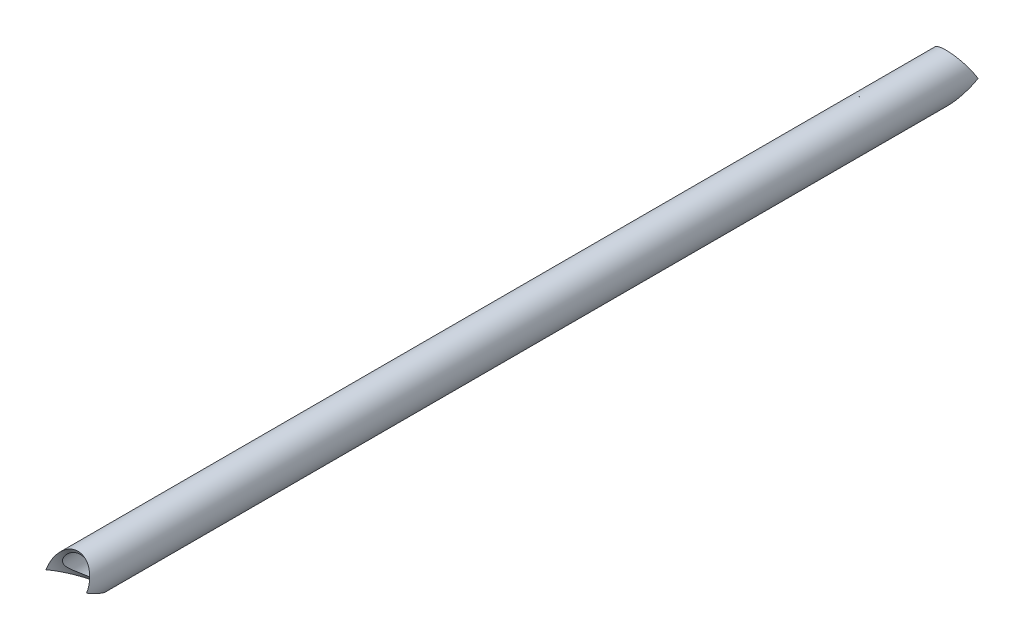
ISO-10303-21;
HEADER;
FILE_DESCRIPTION(('STEP AP214'),'2;1');
FILE_NAME('part.step','',(''),(''),'','','');
FILE_SCHEMA(('AUTOMOTIVE_DESIGN { 1 0 10303 214 1 1 1 1 }'));
ENDSEC;
DATA;
#1=APPLICATION_CONTEXT('core data for automotive mechanical design processes');
#2=APPLICATION_PROTOCOL_DEFINITION('international standard','automotive_design',2000,#1);
#3=PRODUCT_CONTEXT('',#1,'mechanical');
#4=PRODUCT('Part','Part','',(#3));
#5=PRODUCT_RELATED_PRODUCT_CATEGORY('part','',(#4));
#6=PRODUCT_DEFINITION_FORMATION('','',#4);
#7=PRODUCT_DEFINITION_CONTEXT('part definition',#1,'design');
#8=PRODUCT_DEFINITION('design','',#6,#7);
#9=PRODUCT_DEFINITION_SHAPE('','',#8);
#10=(LENGTH_UNIT() NAMED_UNIT(*) SI_UNIT(.MILLI.,.METRE.));
#11=(NAMED_UNIT(*) PLANE_ANGLE_UNIT() SI_UNIT($,.RADIAN.));
#12=(NAMED_UNIT(*) SI_UNIT($,.STERADIAN.) SOLID_ANGLE_UNIT());
#13=UNCERTAINTY_MEASURE_WITH_UNIT(LENGTH_MEASURE(1.E-05),#10,'distance_accuracy_value','');
#14=(GEOMETRIC_REPRESENTATION_CONTEXT(3) GLOBAL_UNCERTAINTY_ASSIGNED_CONTEXT((#13)) GLOBAL_UNIT_ASSIGNED_CONTEXT((#10,
#11,#12)) REPRESENTATION_CONTEXT('',''));
#15=CARTESIAN_POINT('',(0.,0.,0.));
#16=DIRECTION('',(0.,0.,1.));
#17=DIRECTION('',(1.,0.,0.));
#18=AXIS2_PLACEMENT_3D('',#15,#16,#17);
#19=CARTESIAN_POINT('',(7.22684773073331E-13,15.2249999998414,-234.657183252051));
#20=DIRECTION('',(0.,0.,1.));
#21=DIRECTION('',(1.,0.,0.));
#22=AXIS2_PLACEMENT_3D('',#19,#20,#21);
#23=CYLINDRICAL_SURFACE('',#22,10.65);
#24=CARTESIAN_POINT('',(4.00109682529952E-13,15.2249999998414,-233.790157848272));
#25=DIRECTION('',(0.,0.866025403784403,0.500000000000061));
#26=DIRECTION('',(0.,-0.500000000000061,0.866025403784403));
#27=AXIS2_PLACEMENT_3D('',#24,#25,#26);
#28=ELLIPSE('',#27,21.2999999999974,10.65);
#29=CARTESIAN_POINT('',(-10.6499999999996,15.2249999998413,-233.790157848272));
#30=VERTEX_POINT('',#29);
#31=CARTESIAN_POINT('',(10.6500000000004,15.2249999998414,-233.790157848272));
#32=VERTEX_POINT('',#31);
#33=EDGE_CURVE('E54',#30,#32,#28,.T.);
#34=ORIENTED_EDGE('',*,*,#33,.T.);
#35=CARTESIAN_POINT('',(4.00109682529952E-13,15.2249999998414,-233.790157848272));
#36=DIRECTION('',(0.,-0.500000000000061,0.866025403784403));
#37=DIRECTION('',(0.,0.866025403784403,0.500000000000061));
#38=AXIS2_PLACEMENT_3D('',#35,#36,#37);
#39=ELLIPSE('',#38,12.2975607337395,10.65);
#40=EDGE_CURVE('E49',#32,#30,#39,.T.);
#41=ORIENTED_EDGE('',*,*,#40,.T.);
#42=EDGE_LOOP('',(#34,#41));
#43=FACE_BOUND('',#42,.T.);
#44=CARTESIAN_POINT('',(4.00109682529952E-13,15.2249999998414,233.790157848272));
#45=DIRECTION('',(0.,-0.866025403784403,0.500000000000061));
#46=DIRECTION('',(0.,-0.500000000000061,-0.866025403784403));
#47=AXIS2_PLACEMENT_3D('',#44,#45,#46);
#48=ELLIPSE('',#47,21.2999999999974,10.65);
#49=CARTESIAN_POINT('',(-10.6499999999996,15.2249999998413,233.790157848272));
#50=VERTEX_POINT('',#49);
#51=CARTESIAN_POINT('',(10.6500000000004,15.2249999998414,233.790157848272));
#52=VERTEX_POINT('',#51);
#53=EDGE_CURVE('E68',#50,#52,#48,.T.);
#54=ORIENTED_EDGE('',*,*,#53,.F.);
#55=CARTESIAN_POINT('',(4.00109682529952E-13,15.2249999998414,233.790157848272));
#56=DIRECTION('',(0.,0.500000000000061,0.866025403784403));
#57=DIRECTION('',(0.,0.866025403784403,-0.500000000000061));
#58=AXIS2_PLACEMENT_3D('',#55,#56,#57);
#59=ELLIPSE('',#58,12.2975607337395,10.65);
#60=EDGE_CURVE('E64',#52,#50,#59,.T.);
#61=ORIENTED_EDGE('',*,*,#60,.F.);
#62=EDGE_LOOP('',(#54,#61));
#63=FACE_BOUND('',#62,.T.);
#64=ADVANCED_FACE('F35',(#43,#63),#23,.T.);
#65=CARTESIAN_POINT('',(7.22684773073331E-13,15.2249999998414,-234.657183252051));
#66=DIRECTION('',(0.,0.,1.));
#67=DIRECTION('',(1.,0.,0.));
#68=AXIS2_PLACEMENT_3D('',#65,#66,#67);
#69=CYLINDRICAL_SURFACE('',#68,8.65);
#70=CARTESIAN_POINT('',(8.65000000000073,15.2249999998414,-226.616130620373));
#71=CARTESIAN_POINT('',(8.64999937803399,15.3718160818004,-226.700894912656));
#72=CARTESIAN_POINT('',(8.64626274910779,15.5212442750548,-226.781146971246));
#73=CARTESIAN_POINT('',(8.63051404007079,15.8248493483921,-226.931212783866));
#74=CARTESIAN_POINT('',(8.61850310980578,15.9790255658178,-227.001027986623));
#75=CARTESIAN_POINT('',(8.58549136002982,16.2910223316641,-227.128940058791));
#76=CARTESIAN_POINT('',(8.56450206368829,16.448837964336,-227.18705180872));
#77=CARTESIAN_POINT('',(8.51297710355497,16.7669720969905,-227.290912107737));
#78=CARTESIAN_POINT('',(8.48244146927668,16.9272905892338,-227.336660695047));
#79=CARTESIAN_POINT('',(8.41148621827993,17.2489954047633,-227.415698922046));
#80=CARTESIAN_POINT('',(8.37105601253865,17.4103826906284,-227.448975116739));
#81=CARTESIAN_POINT('',(8.2803069748777,17.7323894814726,-227.503521124277));
#82=CARTESIAN_POINT('',(8.22998781020966,17.89300896043,-227.524790533017));
#83=CARTESIAN_POINT('',(8.11955918288916,18.212281770207,-227.556416745183));
#84=CARTESIAN_POINT('',(8.05943008935789,18.3709304576975,-227.566751349751));
#85=CARTESIAN_POINT('',(7.92980127102043,18.6847095954182,-227.577840909392));
#86=CARTESIAN_POINT('',(7.8602988334974,18.8398390119048,-227.578593085198));
#87=CARTESIAN_POINT('',(7.69251740767395,19.1865698489066,-227.571173814547));
#88=CARTESIAN_POINT('',(7.59151815094412,19.3768042793609,-227.560556918566));
#89=CARTESIAN_POINT('',(7.37601667855962,19.7486150847821,-227.529451608018));
#90=CARTESIAN_POINT('',(7.26151062378815,19.9301889774184,-227.508960381682));
#91=CARTESIAN_POINT('',(7.01974442801524,20.2838140012124,-227.460837924336));
#92=CARTESIAN_POINT('',(6.89247464409802,20.4558577777712,-227.433201269746));
#93=CARTESIAN_POINT('',(6.62602035216192,20.7895251718432,-227.373155903022));
#94=CARTESIAN_POINT('',(6.48683667995989,20.9511495189375,-227.340747525531));
#95=CARTESIAN_POINT('',(6.19369921715805,21.2671994087738,-227.272312791844));
#96=CARTESIAN_POINT('',(6.03946719637313,21.4213517420516,-227.236217271972));
#97=CARTESIAN_POINT('',(5.71996280968021,21.7174545818253,-227.162886020473));
#98=CARTESIAN_POINT('',(5.55469039583223,21.8594050353317,-227.125650283895));
#99=CARTESIAN_POINT('',(5.21389860048005,22.13044322919,-227.05154886657));
#100=CARTESIAN_POINT('',(5.03838164400038,22.2595339941816,-227.014683100646));
#101=CARTESIAN_POINT('',(4.67787691764229,22.5042467626478,-226.942583765292));
#102=CARTESIAN_POINT('',(4.49288897525266,22.6198685206627,-226.907350225613));
#103=CARTESIAN_POINT('',(4.08963935720841,22.8511505008844,-226.83518145493));
#104=CARTESIAN_POINT('',(3.8701826263934,22.9648531611738,-226.798622576714));
#105=CARTESIAN_POINT('',(3.4217043491622,23.173307480739,-226.730286500494));
#106=CARTESIAN_POINT('',(3.19268197861239,23.2680575030506,-226.698509715586));
#107=CARTESIAN_POINT('',(2.72667233822177,23.4377489820847,-226.640808535245));
#108=CARTESIAN_POINT('',(2.48968464132822,23.5126893748189,-226.614884454176));
#109=CARTESIAN_POINT('',(2.00954587057649,23.6420083115011,-226.569734191326));
#110=CARTESIAN_POINT('',(1.76639521489104,23.6963882465654,-226.550507556406));
#111=CARTESIAN_POINT('',(1.2868881557807,23.7820463761492,-226.520059675526));
#112=CARTESIAN_POINT('',(1.05071773862648,23.8142532416868,-226.508517392554));
#113=CARTESIAN_POINT('',(0.576287751522983,23.8590696991501,-226.492424570212));
#114=CARTESIAN_POINT('',(0.338028232849895,23.8716797707249,-226.487873859719));
#115=CARTESIAN_POINT('',(-0.13869439806505,23.8771718100365,-226.48589402504));
#116=CARTESIAN_POINT('',(-0.377157454409467,23.870058090146,-226.488463344145));
#117=CARTESIAN_POINT('',(-0.852499060907752,23.8361855579795,-226.500647238579));
#118=CARTESIAN_POINT('',(-1.08937763949892,23.8094270992359,-226.510261687123));
#119=CARTESIAN_POINT('',(-1.55084699909944,23.7379204839427,-226.535767666196));
#120=CARTESIAN_POINT('',(-1.7755636187987,23.6938912062073,-226.551407963394));
#121=CARTESIAN_POINT('',(-2.22033596035067,23.5883037351164,-226.588536726342));
#122=CARTESIAN_POINT('',(-2.44039182888852,23.5267460943044,-226.610025007746));
#123=CARTESIAN_POINT('',(-2.87439182216372,23.3866397888887,-226.658264189429));
#124=CARTESIAN_POINT('',(-3.0883367888249,23.3080934777908,-226.685014360711));
#125=CARTESIAN_POINT('',(-3.50884695014989,23.1346288265682,-226.743033986016));
#126=CARTESIAN_POINT('',(-3.71541192514846,23.0397099996052,-226.774303574419));
#127=CARTESIAN_POINT('',(-4.12561504865864,22.831325502649,-226.841372562656));
#128=CARTESIAN_POINT('',(-4.32901148650069,22.7174169406924,-226.877273860887));
#129=CARTESIAN_POINT('',(-4.72560996425138,22.4738119895755,-226.951704246459));
#130=CARTESIAN_POINT('',(-4.91881176220129,22.3441152259406,-226.990233396121));
#131=CARTESIAN_POINT('',(-5.29426000335198,22.069522023073,-227.068567357932));
#132=CARTESIAN_POINT('',(-5.47649012979042,21.9246037844437,-227.108373941341));
#133=CARTESIAN_POINT('',(-5.82873985001059,21.6205012206976,-227.187523885139));
#134=CARTESIAN_POINT('',(-5.99875927649416,21.4613167001864,-227.226867239176));
#135=CARTESIAN_POINT('',(-6.33518765876969,21.1197976712733,-227.305288821375));
#136=CARTESIAN_POINT('',(-6.50081325634361,20.9366555590635,-227.34421890609));
#137=CARTESIAN_POINT('',(-6.81634213928481,20.5561417387911,-227.416403390943));
#138=CARTESIAN_POINT('',(-6.96624167784245,20.3587666584705,-227.44965643968));
#139=CARTESIAN_POINT('',(-7.24880778216958,19.9513737623284,-227.506850657746));
#140=CARTESIAN_POINT('',(-7.38151120832192,19.7413844496542,-227.530811971641));
#141=CARTESIAN_POINT('',(-7.6287244459524,19.3099425256216,-227.565254829972));
#142=CARTESIAN_POINT('',(-7.74324661530693,19.0884978374414,-227.575745565091));
#143=CARTESIAN_POINT('',(-7.9158766152873,18.7160587990207,-227.578001893572));
#144=CARTESIAN_POINT('',(-7.97965328460072,18.5677011781322,-227.575058543148));
#145=CARTESIAN_POINT('',(-8.09865941914349,18.2680533280594,-227.560206784699));
#146=CARTESIAN_POINT('',(-8.15389168150541,18.1167640769135,-227.548301318069));
#147=CARTESIAN_POINT('',(-8.25543809691468,17.812642488713,-227.51439922725));
#148=CARTESIAN_POINT('',(-8.30176915263715,17.6598136680744,-227.492422002776));
#149=CARTESIAN_POINT('',(-8.38549388456844,17.3536556617893,-227.437533966567));
#150=CARTESIAN_POINT('',(-8.42288752849203,17.2003264743373,-227.404623115336));
#151=CARTESIAN_POINT('',(-8.48887463244747,16.8941626298631,-227.327367948635));
#152=CARTESIAN_POINT('',(-8.51744234753697,16.7413306826692,-227.282990865208));
#153=CARTESIAN_POINT('',(-8.56590540255619,16.4379970093971,-227.183005125143));
#154=CARTESIAN_POINT('',(-8.58580081854666,16.287495262893,-227.127396567016));
#155=CARTESIAN_POINT('',(-8.61742448664785,15.9898085272821,-227.005544044489));
#156=CARTESIAN_POINT('',(-8.62914387610705,15.8426273042066,-226.939288634495));
#157=CARTESIAN_POINT('',(-8.64501885033545,15.5525193055651,-226.797206811531));
#158=CARTESIAN_POINT('',(-8.64917188259929,15.4095939817121,-226.721377177925));
#159=CARTESIAN_POINT('',(-8.65091176420813,15.0680501360609,-226.526977812282));
#160=CARTESIAN_POINT('',(-8.64490991978739,14.8718927976267,-226.404044843864));
#161=CARTESIAN_POINT('',(-8.62080404537257,14.4894744259885,-226.144733870197));
#162=CARTESIAN_POINT('',(-8.6026934922007,14.3032187854212,-226.008348651759));
#163=CARTESIAN_POINT('',(-8.55591593176074,13.9394926138493,-225.724914287507));
#164=CARTESIAN_POINT('',(-8.52721453919738,13.7620528586451,-225.57783167345));
#165=CARTESIAN_POINT('',(-8.46048539057257,13.4156312779869,-225.275958862749));
#166=CARTESIAN_POINT('',(-8.42245385331461,13.2466529151682,-225.121165561541));
#167=CARTESIAN_POINT('',(-8.33930780952866,12.9215977917971,-224.811075805027));
#168=CARTESIAN_POINT('',(-8.29446233610277,12.7652804838344,-224.655957729655));
#169=CARTESIAN_POINT('',(-8.19738755509976,12.4589289374232,-224.341947907114));
#170=CARTESIAN_POINT('',(-8.14515935111355,12.3088937642409,-224.183056726907));
#171=CARTESIAN_POINT('',(-8.03358147622558,12.0142518013584,-223.862487066965));
#172=CARTESIAN_POINT('',(-7.97422521882668,11.8696501968936,-223.700806129377));
#173=CARTESIAN_POINT('',(-7.84858289044741,11.5854414017909,-223.375731108163));
#174=CARTESIAN_POINT('',(-7.78229605383265,11.4458347652481,-223.212336837058));
#175=CARTESIAN_POINT('',(-7.6427878968912,11.1711080330844,-222.884555501144));
#176=CARTESIAN_POINT('',(-7.56956237191822,11.0359907257095,-222.720167891613));
#177=CARTESIAN_POINT('',(-7.41613086611502,10.7699941087927,-222.391193952307));
#178=CARTESIAN_POINT('',(-7.33592422353052,10.6391152026343,-222.226607605156));
#179=CARTESIAN_POINT('',(-7.16842967186054,10.3814777060565,-221.898021928709));
#180=CARTESIAN_POINT('',(-7.08114669097896,10.2547163327706,-221.734022272532));
#181=CARTESIAN_POINT('',(-6.89920629382299,10.005105532055,-221.407139412466));
#182=CARTESIAN_POINT('',(-6.80454875726909,9.88225616847661,-221.244256226833));
#183=CARTESIAN_POINT('',(-6.56519981119186,9.58847523230073,-220.850624992697));
#184=CARTESIAN_POINT('',(-6.41648661666451,9.41956590659714,-220.620790515557));
#185=CARTESIAN_POINT('',(-6.10210401419089,9.08996137975766,-220.166782584085));
#186=CARTESIAN_POINT('',(-5.93643204735804,8.92926742372918,-219.942609990446));
#187=CARTESIAN_POINT('',(-5.58706670598628,8.61728432470592,-219.502991206508));
#188=CARTESIAN_POINT('',(-5.40341885193475,8.46597293363485,-219.287524830915));
#189=CARTESIAN_POINT('',(-5.01605964050921,8.17372410191782,-218.867929591923));
#190=CARTESIAN_POINT('',(-4.8123586935435,8.03278134419002,-218.663794930939));
#191=CARTESIAN_POINT('',(-4.46395431537748,7.81416399882904,-218.345039096985));
#192=CARTESIAN_POINT('',(-4.32596965085769,7.7326734644771,-218.225690934962));
#193=CARTESIAN_POINT('',(-4.04104693269429,7.57523178260297,-217.994255925192));
#194=CARTESIAN_POINT('',(-3.89410768994005,7.49928137372892,-217.882170045925));
#195=CARTESIAN_POINT('',(-3.43953622820758,7.28113656863024,-217.559209424285));
#196=CARTESIAN_POINT('',(-3.1176700065354,7.14833947075684,-217.361179221191));
#197=CARTESIAN_POINT('',(-2.51329904826346,6.94351317804898,-217.054476237116));
#198=CARTESIAN_POINT('',(-2.23837288737253,6.8645329533798,-216.93572334007));
#199=CARTESIAN_POINT('',(-1.81149183588492,6.76554405580963,-216.786571869805));
#200=CARTESIAN_POINT('',(-1.66677696284398,6.7357938880164,-216.741683181232));
#201=CARTESIAN_POINT('',(-1.37323763265758,6.6834013364604,-216.662562118053));
#202=CARTESIAN_POINT('',(-1.22441515227361,6.66075559645266,-216.628324711675));
#203=CARTESIAN_POINT('',(-0.922228530534281,6.62294244718917,-216.571124154793));
#204=CARTESIAN_POINT('',(-0.768835207762177,6.60784573111002,-216.548267588804));
#205=CARTESIAN_POINT('',(-0.460111209938584,6.58586003421763,-216.514972555521));
#206=CARTESIAN_POINT('',(-0.304780550296197,6.57897098816462,-216.504533989521));
#207=CARTESIAN_POINT('',(0.00631804623166447,6.57360376548258,-216.496401803086));
#208=CARTESIAN_POINT('',(0.162085851107275,6.57512327619661,-216.498704678295));
#209=CARTESIAN_POINT('',(0.472597570433297,6.58652292809322,-216.515975036928));
#210=CARTESIAN_POINT('',(0.627341552834819,6.59640250869252,-216.530941671187));
#211=CARTESIAN_POINT('',(0.914629127249535,6.62244206746008,-216.570362791726));
#212=CARTESIAN_POINT('',(1.04746675019312,6.63763010215889,-216.593348267607));
#213=CARTESIAN_POINT('',(1.31053948151404,6.67382250801011,-216.648078264163));
#214=CARTESIAN_POINT('',(1.44077378597097,6.69482864696322,-216.679825447027));
#215=CARTESIAN_POINT('',(1.82650942834367,6.76600299195189,-216.787286668754));
#216=CARTESIAN_POINT('',(2.0771600582016,6.82433819839789,-216.875237206605));
#217=CARTESIAN_POINT('',(2.67701044964176,6.99129326287316,-217.126182647155));
#218=CARTESIAN_POINT('',(3.01657143771883,7.11064022715641,-217.304986048958));
#219=CARTESIAN_POINT('',(3.49694388024367,7.31145299122882,-217.603895772405));
#220=CARTESIAN_POINT('',(3.65245291749751,7.38214607662005,-217.708831773185));
#221=CARTESIAN_POINT('',(3.95415605806255,7.52985212378962,-217.927311057518));
#222=CARTESIAN_POINT('',(4.10035178316934,7.60686397986046,-218.040852834902));
#223=CARTESIAN_POINT('',(4.47217067277774,7.81608637468817,-218.348079482024));
#224=CARTESIAN_POINT('',(4.69046621582142,7.95276812552853,-218.547583966102));
#225=CARTESIAN_POINT('',(5.10542040242039,8.23782777040412,-218.960323284901));
#226=CARTESIAN_POINT('',(5.30206445824768,8.38621343583037,-219.173567225109));
#227=CARTESIAN_POINT('',(5.6761968927379,8.69337975103346,-219.610725395218));
#228=CARTESIAN_POINT('',(5.8536163377949,8.85219472835012,-219.8346741262));
#229=CARTESIAN_POINT('',(6.19021131260048,9.17861787721255,-220.289589023201));
#230=CARTESIAN_POINT('',(6.34939068740982,9.34622418462009,-220.520553697203));
#231=CARTESIAN_POINT('',(6.61712450602773,9.65117219441522,-220.934822249236));
#232=CARTESIAN_POINT('',(6.72902472853608,9.78686772898764,-221.117193803593));
#233=CARTESIAN_POINT('',(6.94326792392773,10.0632070998694,-221.483827944587));
#234=CARTESIAN_POINT('',(7.04560988610146,10.2038514573172,-221.668090728924));
#235=CARTESIAN_POINT('',(7.24122557898535,10.4903127286803,-222.03774866404));
#236=CARTESIAN_POINT('',(7.33449006193109,10.6361347152108,-222.223144769267));
#237=CARTESIAN_POINT('',(7.51210861764725,10.9330709704614,-222.593950216426));
#238=CARTESIAN_POINT('',(7.59646314201729,11.0841849704392,-222.77935955721));
#239=CARTESIAN_POINT('',(7.75620337110443,11.3917551404212,-223.148743259354));
#240=CARTESIAN_POINT('',(7.83161100983228,11.548196982583,-223.33272005168));
#241=CARTESIAN_POINT('',(7.97368173187824,11.8674074246159,-223.698604343378));
#242=CARTESIAN_POINT('',(8.04034383363478,12.0301767320015,-223.880511608386));
#243=CARTESIAN_POINT('',(8.16459670931782,12.362604265179,-224.24063285936));
#244=CARTESIAN_POINT('',(8.22219981237337,12.5322527257581,-224.418851573229));
#245=CARTESIAN_POINT('',(8.32794134031553,12.8796099363814,-224.770109211847));
#246=CARTESIAN_POINT('',(8.37608284212301,13.0573160428585,-224.943149804955));
#247=CARTESIAN_POINT('',(8.4547282351654,13.3908305214131,-225.252923227304));
#248=CARTESIAN_POINT('',(8.48684042867074,13.5451878792815,-225.390805261547));
#249=CARTESIAN_POINT('',(8.54328935211265,13.8610184911046,-225.659918498234));
#250=CARTESIAN_POINT('',(8.56762596647581,14.0224918507884,-225.791149601796));
#251=CARTESIAN_POINT('',(8.607516195672,14.3527812061863,-226.044638846325));
#252=CARTESIAN_POINT('',(8.62309164938118,14.5215778045945,-226.166918631652));
#253=CARTESIAN_POINT('',(8.64433263886653,14.8672631772307,-226.40045613941));
#254=CARTESIAN_POINT('',(8.65000076614836,15.0441498228808,-226.511716736996));
#255=CARTESIAN_POINT('',(8.65000000000073,15.2249999998414,-226.616130620373));
#256=B_SPLINE_CURVE_WITH_KNOTS('',3,(#70,#71,#72,#73,#74,#75,#76,#77,#78,#79,#80,#81,#82,#83,
#84,#85,#86,#87,#88,#89,#90,#91,#92,#93,#94,#95,#96,#97,#98,#99,#100,#101,#102,#103,#104,#105,
#106,#107,#108,#109,#110,#111,#112,#113,#114,#115,#116,#117,#118,#119,#120,#121,#122,#123,#124,
#125,#126,#127,#128,#129,#130,#131,#132,#133,#134,#135,#136,#137,#138,#139,#140,#141,#142,#143,
#144,#145,#146,#147,#148,#149,#150,#151,#152,#153,#154,#155,#156,#157,#158,#159,#160,#161,#162,
#163,#164,#165,#166,#167,#168,#169,#170,#171,#172,#173,#174,#175,#176,#177,#178,#179,#180,#181,
#182,#183,#184,#185,#186,#187,#188,#189,#190,#191,#192,#193,#194,#195,#196,#197,#198,#199,#200,
#201,#202,#203,#204,#205,#206,#207,#208,#209,#210,#211,#212,#213,#214,#215,#216,#217,#218,#219,
#220,#221,#222,#223,#224,#225,#226,#227,#228,#229,#230,#231,#232,#233,#234,#235,#236,#237,#238,
#239,#240,#241,#242,#243,#244,#245,#246,#247,#248,#249,#250,#251,#252,#253,#254,#255),
.UNSPECIFIED.,.T.,.F.,(4,2,2,2,2,2,2,2,2,2,2,2,2,2,2,2,2,2,2,2,2,2,2,2,2,2,2,2,2,2,2,2,2,2,2,2,
2,2,2,2,2,2,2,2,2,2,2,2,2,2,2,2,2,2,2,2,2,2,2,2,2,2,2,2,2,2,2,2,2,2,2,2,2,2,2,2,2,2,2,2,2,2,2,2,
2,2,2,2,2,2,2,2,4),(0.,0.508445067700304,1.01681949312016,1.52454340032971,2.03226573787227,
2.5405338267372,3.04881902097625,3.55813412185301,4.06759693996513,4.7135900294723,
5.35976717786657,6.00643624012391,6.65305997254452,7.3155184468505,7.97797979789311,
8.64028496620519,9.30260220250532,10.0512091879149,10.7998808036042,11.5485926227774,
12.2972537751966,13.0122575701414,13.7272438644486,14.4420738478244,15.1568909672328,
15.8446653307735,16.5324180161263,17.2200754854146,17.9077534057855,18.6145823037829,
19.3214279700604,20.0293001149049,20.73718195642,21.4861817527537,22.2353595985672,
22.9829040159488,23.7299381285006,24.214039266468,24.697981590178,25.1809956610559,
25.6640114767328,26.1484232132304,26.6328307010897,27.117762464654,27.6028577893435,
28.2964167818696,28.9903497083938,29.6865557409422,30.38304439003,31.0569944659833,
31.7308439043491,32.4053208577867,33.0798724008737,33.7548353491974,34.4298623484519,
35.1044232089346,35.7789950738538,36.7434305731185,37.708011809881,38.6702106916391,
39.6319126633933,40.2309613246266,40.8300897097655,42.0261773485563,42.9515592316289,
43.4142860297682,43.8767938980602,44.3435554209341,44.810313233666,45.2769426775155,
45.7435408340741,46.1500870679642,46.5567569645802,47.3697458590112,48.5683011522661,
49.1693990091056,49.7703919045979,50.7462014804331,51.722664537754,52.7025204724632,
53.6821694691644,54.4420360299657,55.2019828498199,55.962695941976,56.723370459009,
57.4821398028629,58.2409942350118,58.9988067717564,59.7563724579487,60.3844095628079,
61.0124560021508,61.6389298975943,62.2652398987969),.UNSPECIFIED.);
#257=CARTESIAN_POINT('',(8.65000000000073,15.2249999998414,-226.616130620373));
#258=VERTEX_POINT('',#257);
#259=EDGE_CURVE('E11',#258,#258,#256,.T.);
#260=ORIENTED_EDGE('',*,*,#259,.F.);
#261=EDGE_LOOP('',(#260));
#262=FACE_BOUND('',#261,.T.);
#263=CARTESIAN_POINT('',(8.65000000000073,15.2249999998414,226.616130620373));
#264=CARTESIAN_POINT('',(8.64999937803399,15.3718160818004,226.700894912656));
#265=CARTESIAN_POINT('',(8.64626274910779,15.5212442750548,226.781146971246));
#266=CARTESIAN_POINT('',(8.63051404007079,15.8248493483921,226.931212783866));
#267=CARTESIAN_POINT('',(8.61850310980578,15.9790255658178,227.001027986623));
#268=CARTESIAN_POINT('',(8.58549136002982,16.2910223316641,227.128940058791));
#269=CARTESIAN_POINT('',(8.56450206368829,16.448837964336,227.18705180872));
#270=CARTESIAN_POINT('',(8.51297710355497,16.7669720969905,227.290912107737));
#271=CARTESIAN_POINT('',(8.48244146927668,16.9272905892338,227.336660695047));
#272=CARTESIAN_POINT('',(8.41148621827993,17.2489954047633,227.415698922046));
#273=CARTESIAN_POINT('',(8.37105601253865,17.4103826906284,227.448975116739));
#274=CARTESIAN_POINT('',(8.2803069748777,17.7323894814726,227.503521124277));
#275=CARTESIAN_POINT('',(8.22998781020966,17.89300896043,227.524790533017));
#276=CARTESIAN_POINT('',(8.11955918288916,18.212281770207,227.556416745183));
#277=CARTESIAN_POINT('',(8.05943008935789,18.3709304576975,227.566751349751));
#278=CARTESIAN_POINT('',(7.92980127102043,18.6847095954182,227.577840909392));
#279=CARTESIAN_POINT('',(7.8602988334974,18.8398390119048,227.578593085198));
#280=CARTESIAN_POINT('',(7.69251740767395,19.1865698489066,227.571173814547));
#281=CARTESIAN_POINT('',(7.59151815094412,19.3768042793609,227.560556918566));
#282=CARTESIAN_POINT('',(7.37601667855962,19.7486150847821,227.529451608018));
#283=CARTESIAN_POINT('',(7.26151062378815,19.9301889774184,227.508960381682));
#284=CARTESIAN_POINT('',(7.01974442801524,20.2838140012124,227.460837924336));
#285=CARTESIAN_POINT('',(6.89247464409802,20.4558577777712,227.433201269746));
#286=CARTESIAN_POINT('',(6.62602035216192,20.7895251718432,227.373155903022));
#287=CARTESIAN_POINT('',(6.48683667995989,20.9511495189375,227.340747525531));
#288=CARTESIAN_POINT('',(6.19369921715805,21.2671994087738,227.272312791844));
#289=CARTESIAN_POINT('',(6.03946719637313,21.4213517420516,227.236217271972));
#290=CARTESIAN_POINT('',(5.71996280968021,21.7174545818253,227.162886020473));
#291=CARTESIAN_POINT('',(5.55469039583223,21.8594050353317,227.125650283895));
#292=CARTESIAN_POINT('',(5.21389860048005,22.13044322919,227.05154886657));
#293=CARTESIAN_POINT('',(5.03838164400038,22.2595339941816,227.014683100646));
#294=CARTESIAN_POINT('',(4.67787691764229,22.5042467626478,226.942583765292));
#295=CARTESIAN_POINT('',(4.49288897525266,22.6198685206627,226.907350225613));
#296=CARTESIAN_POINT('',(4.08963935720841,22.8511505008844,226.83518145493));
#297=CARTESIAN_POINT('',(3.8701826263934,22.9648531611738,226.798622576714));
#298=CARTESIAN_POINT('',(3.4217043491622,23.173307480739,226.730286500494));
#299=CARTESIAN_POINT('',(3.19268197861239,23.2680575030506,226.698509715586));
#300=CARTESIAN_POINT('',(2.72667233822177,23.4377489820847,226.640808535245));
#301=CARTESIAN_POINT('',(2.48968464132822,23.5126893748189,226.614884454176));
#302=CARTESIAN_POINT('',(2.00954587057649,23.6420083115011,226.569734191326));
#303=CARTESIAN_POINT('',(1.76639521489104,23.6963882465654,226.550507556406));
#304=CARTESIAN_POINT('',(1.2868881557807,23.7820463761492,226.520059675526));
#305=CARTESIAN_POINT('',(1.05071773862648,23.8142532416868,226.508517392554));
#306=CARTESIAN_POINT('',(0.576287751522983,23.8590696991501,226.492424570212));
#307=CARTESIAN_POINT('',(0.338028232849895,23.8716797707249,226.487873859719));
#308=CARTESIAN_POINT('',(-0.13869439806505,23.8771718100365,226.48589402504));
#309=CARTESIAN_POINT('',(-0.377157454409467,23.870058090146,226.488463344145));
#310=CARTESIAN_POINT('',(-0.852499060907752,23.8361855579795,226.500647238579));
#311=CARTESIAN_POINT('',(-1.08937763949892,23.8094270992359,226.510261687123));
#312=CARTESIAN_POINT('',(-1.55084699909944,23.7379204839427,226.535767666196));
#313=CARTESIAN_POINT('',(-1.7755636187987,23.6938912062073,226.551407963394));
#314=CARTESIAN_POINT('',(-2.22033596035067,23.5883037351164,226.588536726342));
#315=CARTESIAN_POINT('',(-2.44039182888852,23.5267460943044,226.610025007746));
#316=CARTESIAN_POINT('',(-2.87439182216372,23.3866397888887,226.658264189429));
#317=CARTESIAN_POINT('',(-3.0883367888249,23.3080934777908,226.685014360711));
#318=CARTESIAN_POINT('',(-3.50884695014989,23.1346288265682,226.743033986016));
#319=CARTESIAN_POINT('',(-3.71541192514846,23.0397099996052,226.774303574419));
#320=CARTESIAN_POINT('',(-4.12561504865864,22.831325502649,226.841372562656));
#321=CARTESIAN_POINT('',(-4.32901148650069,22.7174169406924,226.877273860887));
#322=CARTESIAN_POINT('',(-4.72560996425138,22.4738119895755,226.951704246459));
#323=CARTESIAN_POINT('',(-4.91881176220129,22.3441152259406,226.990233396121));
#324=CARTESIAN_POINT('',(-5.29426000335198,22.069522023073,227.068567357932));
#325=CARTESIAN_POINT('',(-5.47649012979042,21.9246037844437,227.108373941341));
#326=CARTESIAN_POINT('',(-5.82873985001059,21.6205012206976,227.187523885139));
#327=CARTESIAN_POINT('',(-5.99875927649416,21.4613167001864,227.226867239176));
#328=CARTESIAN_POINT('',(-6.33518765876969,21.1197976712733,227.305288821375));
#329=CARTESIAN_POINT('',(-6.50081325634361,20.9366555590635,227.34421890609));
#330=CARTESIAN_POINT('',(-6.81634213928481,20.5561417387911,227.416403390943));
#331=CARTESIAN_POINT('',(-6.96624167784245,20.3587666584705,227.44965643968));
#332=CARTESIAN_POINT('',(-7.24880778216958,19.9513737623284,227.506850657746));
#333=CARTESIAN_POINT('',(-7.38151120832192,19.7413844496542,227.530811971641));
#334=CARTESIAN_POINT('',(-7.6287244459524,19.3099425256216,227.565254829972));
#335=CARTESIAN_POINT('',(-7.74324661530693,19.0884978374414,227.575745565091));
#336=CARTESIAN_POINT('',(-7.9158766152873,18.7160587990207,227.578001893572));
#337=CARTESIAN_POINT('',(-7.97965328460072,18.5677011781322,227.575058543148));
#338=CARTESIAN_POINT('',(-8.09865941914349,18.2680533280594,227.560206784699));
#339=CARTESIAN_POINT('',(-8.15389168150541,18.1167640769135,227.548301318069));
#340=CARTESIAN_POINT('',(-8.25543809691468,17.812642488713,227.51439922725));
#341=CARTESIAN_POINT('',(-8.30176915263715,17.6598136680744,227.492422002776));
#342=CARTESIAN_POINT('',(-8.38549388456844,17.3536556617893,227.437533966567));
#343=CARTESIAN_POINT('',(-8.42288752849203,17.2003264743373,227.404623115336));
#344=CARTESIAN_POINT('',(-8.48887463244747,16.8941626298631,227.327367948635));
#345=CARTESIAN_POINT('',(-8.51744234753697,16.7413306826692,227.282990865208));
#346=CARTESIAN_POINT('',(-8.56590540255619,16.4379970093971,227.183005125143));
#347=CARTESIAN_POINT('',(-8.58580081854666,16.287495262893,227.127396567016));
#348=CARTESIAN_POINT('',(-8.61742448664785,15.9898085272821,227.005544044489));
#349=CARTESIAN_POINT('',(-8.62914387610705,15.8426273042066,226.939288634495));
#350=CARTESIAN_POINT('',(-8.64501885033545,15.5525193055651,226.797206811531));
#351=CARTESIAN_POINT('',(-8.64917188259929,15.4095939817121,226.721377177925));
#352=CARTESIAN_POINT('',(-8.65091176420813,15.0680501360609,226.526977812282));
#353=CARTESIAN_POINT('',(-8.64490991978739,14.8718927976267,226.404044843864));
#354=CARTESIAN_POINT('',(-8.62080404537257,14.4894744259885,226.144733870197));
#355=CARTESIAN_POINT('',(-8.6026934922007,14.3032187854212,226.008348651759));
#356=CARTESIAN_POINT('',(-8.55591593176074,13.9394926138493,225.724914287507));
#357=CARTESIAN_POINT('',(-8.52721453919738,13.7620528586451,225.57783167345));
#358=CARTESIAN_POINT('',(-8.46048539057257,13.4156312779869,225.275958862749));
#359=CARTESIAN_POINT('',(-8.42245385331461,13.2466529151682,225.121165561541));
#360=CARTESIAN_POINT('',(-8.33930780952866,12.9215977917971,224.811075805027));
#361=CARTESIAN_POINT('',(-8.29446233610277,12.7652804838344,224.655957729655));
#362=CARTESIAN_POINT('',(-8.19738755509976,12.4589289374232,224.341947907114));
#363=CARTESIAN_POINT('',(-8.14515935111355,12.3088937642409,224.183056726907));
#364=CARTESIAN_POINT('',(-8.03358147622558,12.0142518013584,223.862487066965));
#365=CARTESIAN_POINT('',(-7.97422521882668,11.8696501968936,223.700806129377));
#366=CARTESIAN_POINT('',(-7.84858289044741,11.5854414017909,223.375731108163));
#367=CARTESIAN_POINT('',(-7.78229605383265,11.4458347652481,223.212336837058));
#368=CARTESIAN_POINT('',(-7.6427878968912,11.1711080330844,222.884555501144));
#369=CARTESIAN_POINT('',(-7.56956237191822,11.0359907257095,222.720167891613));
#370=CARTESIAN_POINT('',(-7.41613086611502,10.7699941087927,222.391193952307));
#371=CARTESIAN_POINT('',(-7.33592422353052,10.6391152026343,222.226607605156));
#372=CARTESIAN_POINT('',(-7.16842967186054,10.3814777060565,221.898021928709));
#373=CARTESIAN_POINT('',(-7.08114669097896,10.2547163327706,221.734022272532));
#374=CARTESIAN_POINT('',(-6.89920629382299,10.005105532055,221.407139412466));
#375=CARTESIAN_POINT('',(-6.80454875726909,9.88225616847661,221.244256226833));
#376=CARTESIAN_POINT('',(-6.56519981119186,9.58847523230073,220.850624992697));
#377=CARTESIAN_POINT('',(-6.41648661666451,9.41956590659714,220.620790515557));
#378=CARTESIAN_POINT('',(-6.10210401419089,9.08996137975766,220.166782584085));
#379=CARTESIAN_POINT('',(-5.93643204735804,8.92926742372918,219.942609990446));
#380=CARTESIAN_POINT('',(-5.58706670598628,8.61728432470592,219.502991206508));
#381=CARTESIAN_POINT('',(-5.40341885193475,8.46597293363485,219.287524830915));
#382=CARTESIAN_POINT('',(-5.01605964050921,8.17372410191782,218.867929591923));
#383=CARTESIAN_POINT('',(-4.8123586935435,8.03278134419002,218.663794930939));
#384=CARTESIAN_POINT('',(-4.46395431537748,7.81416399882904,218.345039096985));
#385=CARTESIAN_POINT('',(-4.32596965085769,7.7326734644771,218.225690934962));
#386=CARTESIAN_POINT('',(-4.04104693269429,7.57523178260297,217.994255925192));
#387=CARTESIAN_POINT('',(-3.89410768994005,7.49928137372892,217.882170045925));
#388=CARTESIAN_POINT('',(-3.43953622820758,7.28113656863024,217.559209424285));
#389=CARTESIAN_POINT('',(-3.1176700065354,7.14833947075684,217.361179221191));
#390=CARTESIAN_POINT('',(-2.51329904826346,6.94351317804898,217.054476237116));
#391=CARTESIAN_POINT('',(-2.23837288737253,6.8645329533798,216.93572334007));
#392=CARTESIAN_POINT('',(-1.81149183588492,6.76554405580963,216.786571869805));
#393=CARTESIAN_POINT('',(-1.66677696284398,6.7357938880164,216.741683181232));
#394=CARTESIAN_POINT('',(-1.37323763265758,6.6834013364604,216.662562118053));
#395=CARTESIAN_POINT('',(-1.22441515227361,6.66075559645266,216.628324711675));
#396=CARTESIAN_POINT('',(-0.922228530534281,6.62294244718917,216.571124154793));
#397=CARTESIAN_POINT('',(-0.768835207762177,6.60784573111002,216.548267588804));
#398=CARTESIAN_POINT('',(-0.460111209938584,6.58586003421763,216.514972555521));
#399=CARTESIAN_POINT('',(-0.304780550296197,6.57897098816462,216.504533989521));
#400=CARTESIAN_POINT('',(0.00631804623166447,6.57360376548258,216.496401803086));
#401=CARTESIAN_POINT('',(0.162085851107275,6.57512327619661,216.498704678295));
#402=CARTESIAN_POINT('',(0.472597570433297,6.58652292809322,216.515975036928));
#403=CARTESIAN_POINT('',(0.627341552834819,6.59640250869252,216.530941671187));
#404=CARTESIAN_POINT('',(0.914629127249535,6.62244206746008,216.570362791726));
#405=CARTESIAN_POINT('',(1.04746675019312,6.63763010215889,216.593348267607));
#406=CARTESIAN_POINT('',(1.31053948151404,6.67382250801011,216.648078264163));
#407=CARTESIAN_POINT('',(1.44077378597097,6.69482864696322,216.679825447027));
#408=CARTESIAN_POINT('',(1.82650942834367,6.76600299195189,216.787286668754));
#409=CARTESIAN_POINT('',(2.0771600582016,6.82433819839789,216.875237206605));
#410=CARTESIAN_POINT('',(2.67701044964176,6.99129326287316,217.126182647155));
#411=CARTESIAN_POINT('',(3.01657143771883,7.11064022715641,217.304986048958));
#412=CARTESIAN_POINT('',(3.49694388024367,7.31145299122882,217.603895772405));
#413=CARTESIAN_POINT('',(3.65245291749751,7.38214607662005,217.708831773185));
#414=CARTESIAN_POINT('',(3.95415605806255,7.52985212378962,217.927311057518));
#415=CARTESIAN_POINT('',(4.10035178316934,7.60686397986046,218.040852834902));
#416=CARTESIAN_POINT('',(4.47217067277774,7.81608637468817,218.348079482024));
#417=CARTESIAN_POINT('',(4.69046621582142,7.95276812552853,218.547583966102));
#418=CARTESIAN_POINT('',(5.10542040242039,8.23782777040412,218.960323284901));
#419=CARTESIAN_POINT('',(5.30206445824768,8.38621343583037,219.173567225109));
#420=CARTESIAN_POINT('',(5.6761968927379,8.69337975103346,219.610725395218));
#421=CARTESIAN_POINT('',(5.8536163377949,8.85219472835012,219.8346741262));
#422=CARTESIAN_POINT('',(6.19021131260048,9.17861787721255,220.289589023201));
#423=CARTESIAN_POINT('',(6.34939068740982,9.34622418462009,220.520553697203));
#424=CARTESIAN_POINT('',(6.61712450602773,9.65117219441522,220.934822249236));
#425=CARTESIAN_POINT('',(6.72902472853608,9.78686772898764,221.117193803593));
#426=CARTESIAN_POINT('',(6.94326792392773,10.0632070998694,221.483827944587));
#427=CARTESIAN_POINT('',(7.04560988610146,10.2038514573172,221.668090728924));
#428=CARTESIAN_POINT('',(7.24122557898535,10.4903127286803,222.03774866404));
#429=CARTESIAN_POINT('',(7.33449006193109,10.6361347152108,222.223144769267));
#430=CARTESIAN_POINT('',(7.51210861764725,10.9330709704614,222.593950216426));
#431=CARTESIAN_POINT('',(7.59646314201729,11.0841849704392,222.77935955721));
#432=CARTESIAN_POINT('',(7.75620337110443,11.3917551404212,223.148743259354));
#433=CARTESIAN_POINT('',(7.83161100983228,11.548196982583,223.33272005168));
#434=CARTESIAN_POINT('',(7.97368173187824,11.8674074246159,223.698604343378));
#435=CARTESIAN_POINT('',(8.04034383363478,12.0301767320015,223.880511608386));
#436=CARTESIAN_POINT('',(8.16459670931782,12.362604265179,224.24063285936));
#437=CARTESIAN_POINT('',(8.22219981237337,12.5322527257581,224.418851573229));
#438=CARTESIAN_POINT('',(8.32794134031553,12.8796099363814,224.770109211847));
#439=CARTESIAN_POINT('',(8.37608284212301,13.0573160428585,224.943149804955));
#440=CARTESIAN_POINT('',(8.4547282351654,13.3908305214131,225.252923227304));
#441=CARTESIAN_POINT('',(8.48684042867074,13.5451878792815,225.390805261547));
#442=CARTESIAN_POINT('',(8.54328935211265,13.8610184911046,225.659918498234));
#443=CARTESIAN_POINT('',(8.56762596647581,14.0224918507884,225.791149601796));
#444=CARTESIAN_POINT('',(8.607516195672,14.3527812061863,226.044638846325));
#445=CARTESIAN_POINT('',(8.62309164938118,14.5215778045945,226.166918631652));
#446=CARTESIAN_POINT('',(8.64433263886653,14.8672631772307,226.40045613941));
#447=CARTESIAN_POINT('',(8.65000076614836,15.0441498228808,226.511716736996));
#448=CARTESIAN_POINT('',(8.65000000000073,15.2249999998414,226.616130620373));
#449=B_SPLINE_CURVE_WITH_KNOTS('',3,(#263,#264,#265,#266,#267,#268,#269,#270,#271,#272,#273,
#274,#275,#276,#277,#278,#279,#280,#281,#282,#283,#284,#285,#286,#287,#288,#289,#290,#291,#292,
#293,#294,#295,#296,#297,#298,#299,#300,#301,#302,#303,#304,#305,#306,#307,#308,#309,#310,#311,
#312,#313,#314,#315,#316,#317,#318,#319,#320,#321,#322,#323,#324,#325,#326,#327,#328,#329,#330,
#331,#332,#333,#334,#335,#336,#337,#338,#339,#340,#341,#342,#343,#344,#345,#346,#347,#348,#349,
#350,#351,#352,#353,#354,#355,#356,#357,#358,#359,#360,#361,#362,#363,#364,#365,#366,#367,#368,
#369,#370,#371,#372,#373,#374,#375,#376,#377,#378,#379,#380,#381,#382,#383,#384,#385,#386,#387,
#388,#389,#390,#391,#392,#393,#394,#395,#396,#397,#398,#399,#400,#401,#402,#403,#404,#405,#406,
#407,#408,#409,#410,#411,#412,#413,#414,#415,#416,#417,#418,#419,#420,#421,#422,#423,#424,#425,
#426,#427,#428,#429,#430,#431,#432,#433,#434,#435,#436,#437,#438,#439,#440,#441,#442,#443,#444,
#445,#446,#447,#448),.UNSPECIFIED.,.T.,.F.,(4,2,2,2,2,2,2,2,2,2,2,2,2,2,2,2,2,2,2,2,2,2,2,2,2,2,
2,2,2,2,2,2,2,2,2,2,2,2,2,2,2,2,2,2,2,2,2,2,2,2,2,2,2,2,2,2,2,2,2,2,2,2,2,2,2,2,2,2,2,2,2,2,2,2,
2,2,2,2,2,2,2,2,2,2,2,2,2,2,2,2,2,2,4),(0.,0.508445067700304,1.01681949312016,1.52454340032971,
2.03226573787227,2.5405338267372,3.04881902097625,3.55813412185301,4.06759693996513,
4.7135900294723,5.35976717786657,6.00643624012391,6.65305997254452,7.3155184468505,
7.97797979789311,8.64028496620519,9.30260220250532,10.0512091879149,10.7998808036042,
11.5485926227774,12.2972537751966,13.0122575701414,13.7272438644486,14.4420738478244,
15.1568909672328,15.8446653307735,16.5324180161263,17.2200754854146,17.9077534057855,
18.6145823037829,19.3214279700604,20.0293001149049,20.73718195642,21.4861817527537,
22.2353595985672,22.9829040159488,23.7299381285006,24.214039266468,24.697981590178,
25.1809956610559,25.6640114767328,26.1484232132304,26.6328307010897,27.117762464654,
27.6028577893435,28.2964167818696,28.9903497083938,29.6865557409422,30.38304439003,
31.0569944659833,31.7308439043491,32.4053208577867,33.0798724008737,33.7548353491974,
34.4298623484519,35.1044232089346,35.7789950738538,36.7434305731185,37.708011809881,
38.6702106916391,39.6319126633933,40.2309613246266,40.8300897097655,42.0261773485563,
42.9515592316289,43.4142860297682,43.8767938980602,44.3435554209341,44.810313233666,
45.2769426775155,45.7435408340741,46.1500870679642,46.5567569645802,47.3697458590112,
48.5683011522661,49.1693990091056,49.7703919045979,50.7462014804331,51.722664537754,
52.7025204724632,53.6821694691644,54.4420360299657,55.2019828498199,55.962695941976,
56.723370459009,57.4821398028629,58.2409942350118,58.9988067717564,59.7563724579487,
60.3844095628079,61.0124560021508,61.6389298975943,62.2652398987969),.UNSPECIFIED.);
#450=CARTESIAN_POINT('',(8.65000000000073,15.2249999998414,226.616130620373));
#451=VERTEX_POINT('',#450);
#452=EDGE_CURVE('E70',#451,#451,#449,.T.);
#453=ORIENTED_EDGE('',*,*,#452,.T.);
#454=EDGE_LOOP('',(#453));
#455=FACE_BOUND('',#454,.T.);
#456=ADVANCED_FACE('F84',(#262,#455),#69,.F.);
#457=CARTESIAN_POINT('',(1.07704132147375E-13,0.749999999825224,-225.433012701746));
#458=DIRECTION('',(0.,-0.866025403784509,0.499999999999877));
#459=DIRECTION('',(-1.27906787077986E-10,-0.499999999999877,-0.866025403784509));
#460=AXIS2_PLACEMENT_3D('',#457,#458,#459);
#461=CYLINDRICAL_SURFACE('',#460,10.65);
#462=ORIENTED_EDGE('',*,*,#40,.F.);
#463=ORIENTED_EDGE('',*,*,#33,.F.);
#464=EDGE_LOOP('',(#462,#463));
#465=FACE_BOUND('',#464,.T.);
#466=ORIENTED_EDGE('',*,*,#259,.T.);
#467=EDGE_LOOP('',(#466));
#468=FACE_BOUND('',#467,.T.);
#469=ADVANCED_FACE('F37',(#465,#468),#461,.F.);
#470=CARTESIAN_POINT('',(1.07704132147375E-13,0.749999999825224,225.433012701746));
#471=DIRECTION('',(0.,-0.866025403784509,-0.499999999999877));
#472=DIRECTION('',(-1.27906787077986E-10,-0.499999999999877,0.866025403784509));
#473=AXIS2_PLACEMENT_3D('',#470,#471,#472);
#474=CYLINDRICAL_SURFACE('',#473,10.65);
#475=ORIENTED_EDGE('',*,*,#60,.T.);
#476=ORIENTED_EDGE('',*,*,#53,.T.);
#477=EDGE_LOOP('',(#475,#476));
#478=FACE_BOUND('',#477,.T.);
#479=ORIENTED_EDGE('',*,*,#452,.F.);
#480=EDGE_LOOP('',(#479));
#481=FACE_BOUND('',#480,.T.);
#482=ADVANCED_FACE('F66',(#478,#481),#474,.F.);
#483=CLOSED_SHELL('',(#64,#456,#469,#482));
#484=MANIFOLD_SOLID_BREP('B2',#483);
#485=ADVANCED_BREP_SHAPE_REPRESENTATION('',(#18,#484),#14);
#486=SHAPE_DEFINITION_REPRESENTATION(#9,#485);
ENDSEC;
END-ISO-10303-21;
